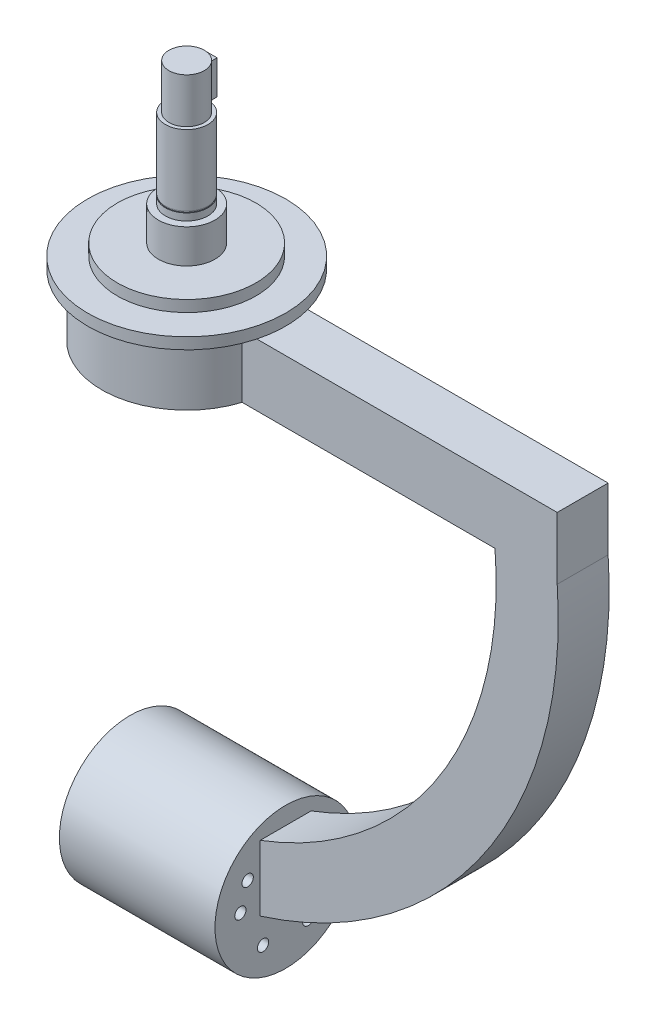
ISO-10303-21;
HEADER;
FILE_DESCRIPTION(('STEP AP214'),'2;1');
FILE_NAME('part.step','',(''),(''),'','','');
FILE_SCHEMA(('AUTOMOTIVE_DESIGN { 1 0 10303 214 1 1 1 1 }'));
ENDSEC;
DATA;
#1=APPLICATION_CONTEXT('core data for automotive mechanical design processes');
#2=APPLICATION_PROTOCOL_DEFINITION('international standard','automotive_design',2000,#1);
#3=PRODUCT_CONTEXT('',#1,'mechanical');
#4=PRODUCT('Part','Part','',(#3));
#5=PRODUCT_RELATED_PRODUCT_CATEGORY('part','',(#4));
#6=PRODUCT_DEFINITION_FORMATION('','',#4);
#7=PRODUCT_DEFINITION_CONTEXT('part definition',#1,'design');
#8=PRODUCT_DEFINITION('design','',#6,#7);
#9=PRODUCT_DEFINITION_SHAPE('','',#8);
#10=(LENGTH_UNIT() NAMED_UNIT(*) SI_UNIT(.MILLI.,.METRE.));
#11=(NAMED_UNIT(*) PLANE_ANGLE_UNIT() SI_UNIT($,.RADIAN.));
#12=(NAMED_UNIT(*) SI_UNIT($,.STERADIAN.) SOLID_ANGLE_UNIT());
#13=UNCERTAINTY_MEASURE_WITH_UNIT(LENGTH_MEASURE(1.E-05),#10,'distance_accuracy_value','');
#14=(GEOMETRIC_REPRESENTATION_CONTEXT(3) GLOBAL_UNCERTAINTY_ASSIGNED_CONTEXT((#13)) GLOBAL_UNIT_ASSIGNED_CONTEXT((#10,
#11,#12)) REPRESENTATION_CONTEXT('',''));
#15=CARTESIAN_POINT('',(0.,0.,0.));
#16=DIRECTION('',(0.,0.,1.));
#17=DIRECTION('',(1.,0.,0.));
#18=AXIS2_PLACEMENT_3D('',#15,#16,#17);
#19=CARTESIAN_POINT('',(0.,-160.641144237927,0.));
#20=DIRECTION('',(-1.,0.,0.));
#21=DIRECTION('',(0.,0.,-1.));
#22=AXIS2_PLACEMENT_3D('',#19,#20,#21);
#23=CYLINDRICAL_SURFACE('',#22,20.);
#24=CARTESIAN_POINT('',(-20.,-160.641144237927,0.));
#25=DIRECTION('',(1.,0.,0.));
#26=DIRECTION('',(0.,0.,-1.));
#27=AXIS2_PLACEMENT_3D('',#24,#25,#26);
#28=CIRCLE('',#27,20.);
#29=CARTESIAN_POINT('',(-20.,-160.641144237927,20.));
#30=VERTEX_POINT('',#29);
#31=EDGE_CURVE('E407',#30,#30,#28,.T.);
#32=ORIENTED_EDGE('',*,*,#31,.F.);
#33=DIRECTION('',(1.,0.,0.));
#34=VECTOR('',#33,1.);
#35=CARTESIAN_POINT('',(0.,-160.641144237927,20.));
#36=LINE('',#35,#34);
#37=CARTESIAN_POINT('',(30.,-160.641144237927,20.));
#38=VERTEX_POINT('',#37);
#39=EDGE_CURVE('E11',#30,#38,#36,.T.);
#40=ORIENTED_EDGE('',*,*,#39,.T.);
#41=CARTESIAN_POINT('',(30.,-160.641144237927,0.));
#42=DIRECTION('',(-1.,0.,0.));
#43=DIRECTION('',(0.,0.,-1.));
#44=AXIS2_PLACEMENT_3D('',#41,#42,#43);
#45=CIRCLE('',#44,20.);
#46=EDGE_CURVE('E343',#38,#38,#45,.T.);
#47=ORIENTED_EDGE('',*,*,#46,.F.);
#48=ORIENTED_EDGE('',*,*,#39,.F.);
#49=EDGE_LOOP('',(#32,#40,#47,#48));
#50=FACE_BOUND('',#49,.T.);
#51=ADVANCED_FACE('F17',(#50),#23,.F.);
#52=CARTESIAN_POINT('',(0.,-160.641144237927,0.));
#53=DIRECTION('',(-1.,0.,0.));
#54=DIRECTION('',(0.,0.,1.));
#55=AXIS2_PLACEMENT_3D('',#52,#53,#54);
#56=CYLINDRICAL_SURFACE('',#55,25.);
#57=CARTESIAN_POINT('',(-20.,-160.641144237927,0.));
#58=DIRECTION('',(-1.,0.,0.));
#59=DIRECTION('',(0.,0.,1.));
#60=AXIS2_PLACEMENT_3D('',#57,#58,#59);
#61=CIRCLE('',#60,25.);
#62=CARTESIAN_POINT('',(-20.,-160.641144237927,-25.));
#63=VERTEX_POINT('',#62);
#64=EDGE_CURVE('E405',#63,#63,#61,.T.);
#65=ORIENTED_EDGE('',*,*,#64,.F.);
#66=DIRECTION('',(1.,0.,0.));
#67=VECTOR('',#66,1.);
#68=CARTESIAN_POINT('',(0.,-160.641144237927,-25.));
#69=LINE('',#68,#67);
#70=CARTESIAN_POINT('',(35.,-160.641144237927,-25.));
#71=VERTEX_POINT('',#70);
#72=EDGE_CURVE('E27',#63,#71,#69,.T.);
#73=ORIENTED_EDGE('',*,*,#72,.T.);
#74=CARTESIAN_POINT('',(35.,-160.641144237927,0.));
#75=DIRECTION('',(1.,0.,0.));
#76=DIRECTION('',(0.,0.,-1.));
#77=AXIS2_PLACEMENT_3D('',#74,#75,#76);
#78=CIRCLE('',#77,25.);
#79=EDGE_CURVE('E304',#71,#71,#78,.T.);
#80=ORIENTED_EDGE('',*,*,#79,.F.);
#81=ORIENTED_EDGE('',*,*,#72,.F.);
#82=EDGE_LOOP('',(#65,#73,#80,#81));
#83=FACE_BOUND('',#82,.T.);
#84=ADVANCED_FACE('F531',(#83),#56,.T.);
#85=CARTESIAN_POINT('',(-20.,-160.641144237927,0.));
#86=DIRECTION('',(-1.,0.,0.));
#87=DIRECTION('',(0.,0.,1.));
#88=AXIS2_PLACEMENT_3D('',#85,#86,#87);
#89=PLANE('',#88);
#90=ORIENTED_EDGE('',*,*,#31,.T.);
#91=EDGE_LOOP('',(#90));
#92=FACE_BOUND('',#91,.T.);
#93=ORIENTED_EDGE('',*,*,#64,.T.);
#94=EDGE_LOOP('',(#93));
#95=FACE_BOUND('',#94,.T.);
#96=ADVANCED_FACE('F561',(#92,#95),#89,.T.);
#97=CARTESIAN_POINT('',(0.,0.,0.));
#98=DIRECTION('',(0.,1.,0.));
#99=DIRECTION('',(-1.,0.,0.));
#100=AXIS2_PLACEMENT_3D('',#97,#98,#99);
#101=CYLINDRICAL_SURFACE('',#100,30.);
#102=DIRECTION('',(0.,1.,0.));
#103=VECTOR('',#102,1.);
#104=CARTESIAN_POINT('',(28.6181760425084,11.,-9.));
#105=LINE('',#104,#103);
#106=CARTESIAN_POINT('',(28.6181760425084,-11.,-9.));
#107=VERTEX_POINT('',#106);
#108=CARTESIAN_POINT('',(28.6181760425084,11.,-9.));
#109=VERTEX_POINT('',#108);
#110=EDGE_CURVE('E221',#107,#109,#105,.T.);
#111=ORIENTED_EDGE('',*,*,#110,.F.);
#112=CARTESIAN_POINT('',(0.,-11.,0.));
#113=DIRECTION('',(0.,-1.,0.));
#114=DIRECTION('',(1.,0.,0.));
#115=AXIS2_PLACEMENT_3D('',#112,#113,#114);
#116=CIRCLE('',#115,30.);
#117=CARTESIAN_POINT('',(28.6181760425084,-11.,9.));
#118=VERTEX_POINT('',#117);
#119=EDGE_CURVE('E213',#118,#107,#116,.T.);
#120=ORIENTED_EDGE('',*,*,#119,.F.);
#121=DIRECTION('',(0.,1.,0.));
#122=VECTOR('',#121,1.);
#123=CARTESIAN_POINT('',(28.6181760425084,0.,9.));
#124=LINE('',#123,#122);
#125=CARTESIAN_POINT('',(28.6181760425084,11.,9.));
#126=VERTEX_POINT('',#125);
#127=EDGE_CURVE('E218',#118,#126,#124,.T.);
#128=ORIENTED_EDGE('',*,*,#127,.T.);
#129=CARTESIAN_POINT('',(0.,11.,0.));
#130=DIRECTION('',(0.,1.,0.));
#131=DIRECTION('',(-1.,0.,0.));
#132=AXIS2_PLACEMENT_3D('',#129,#130,#131);
#133=CIRCLE('',#132,30.);
#134=EDGE_CURVE('E21',#109,#126,#133,.T.);
#135=ORIENTED_EDGE('',*,*,#134,.F.);
#136=EDGE_LOOP('',(#111,#120,#128,#135));
#137=FACE_BOUND('',#136,.T.);
#138=ADVANCED_FACE('F215',(#137),#101,.T.);
#139=CARTESIAN_POINT('',(0.,15.,0.));
#140=DIRECTION('',(0.,1.,0.));
#141=DIRECTION('',(1.,0.,0.));
#142=AXIS2_PLACEMENT_3D('',#139,#140,#141);
#143=PLANE('',#142);
#144=CARTESIAN_POINT('',(0.,15.,0.));
#145=DIRECTION('',(0.,-1.,0.));
#146=DIRECTION('',(1.,0.,0.));
#147=AXIS2_PLACEMENT_3D('',#144,#145,#146);
#148=CIRCLE('',#147,24.5);
#149=CARTESIAN_POINT('',(-24.5,15.,0.));
#150=VERTEX_POINT('',#149);
#151=EDGE_CURVE('E305',#150,#150,#148,.T.);
#152=ORIENTED_EDGE('',*,*,#151,.T.);
#153=EDGE_LOOP('',(#152));
#154=FACE_BOUND('',#153,.T.);
#155=CARTESIAN_POINT('',(0.,15.,0.));
#156=DIRECTION('',(0.,1.,0.));
#157=DIRECTION('',(1.,0.,0.));
#158=AXIS2_PLACEMENT_3D('',#155,#156,#157);
#159=CIRCLE('',#158,35.);
#160=CARTESIAN_POINT('',(-35.,15.,0.));
#161=VERTEX_POINT('',#160);
#162=EDGE_CURVE('E406',#161,#161,#159,.T.);
#163=ORIENTED_EDGE('',*,*,#162,.T.);
#164=EDGE_LOOP('',(#163));
#165=FACE_BOUND('',#164,.T.);
#166=ADVANCED_FACE('F658',(#154,#165),#143,.T.);
#167=CARTESIAN_POINT('',(0.,11.,0.));
#168=DIRECTION('',(0.,1.,0.));
#169=DIRECTION('',(1.,0.,0.));
#170=AXIS2_PLACEMENT_3D('',#167,#168,#169);
#171=CYLINDRICAL_SURFACE('',#170,35.);
#172=ORIENTED_EDGE('',*,*,#162,.F.);
#173=DIRECTION('',(0.,-1.,0.));
#174=VECTOR('',#173,1.);
#175=CARTESIAN_POINT('',(-35.,11.,0.));
#176=LINE('',#175,#174);
#177=CARTESIAN_POINT('',(-35.,11.,0.));
#178=VERTEX_POINT('',#177);
#179=EDGE_CURVE('E401',#161,#178,#176,.T.);
#180=ORIENTED_EDGE('',*,*,#179,.T.);
#181=CARTESIAN_POINT('',(0.,11.,0.));
#182=DIRECTION('',(0.,1.,0.));
#183=DIRECTION('',(1.,0.,0.));
#184=AXIS2_PLACEMENT_3D('',#181,#182,#183);
#185=CIRCLE('',#184,35.);
#186=CARTESIAN_POINT('',(33.8230690505755,11.,9.));
#187=VERTEX_POINT('',#186);
#188=EDGE_CURVE('E397',#178,#187,#185,.T.);
#189=ORIENTED_EDGE('',*,*,#188,.T.);
#190=CARTESIAN_POINT('',(0.,11.,0.));
#191=DIRECTION('',(0.,1.,0.));
#192=DIRECTION('',(1.,0.,0.));
#193=AXIS2_PLACEMENT_3D('',#190,#191,#192);
#194=CIRCLE('',#193,35.);
#195=CARTESIAN_POINT('',(33.8230690505755,11.,-9.));
#196=VERTEX_POINT('',#195);
#197=EDGE_CURVE('E259',#187,#196,#194,.T.);
#198=ORIENTED_EDGE('',*,*,#197,.T.);
#199=CARTESIAN_POINT('',(0.,11.,0.));
#200=DIRECTION('',(0.,1.,0.));
#201=DIRECTION('',(1.,0.,0.));
#202=AXIS2_PLACEMENT_3D('',#199,#200,#201);
#203=CIRCLE('',#202,35.);
#204=EDGE_CURVE('E400',#196,#178,#203,.T.);
#205=ORIENTED_EDGE('',*,*,#204,.T.);
#206=ORIENTED_EDGE('',*,*,#179,.F.);
#207=EDGE_LOOP('',(#172,#180,#189,#198,#205,#206));
#208=FACE_BOUND('',#207,.T.);
#209=ADVANCED_FACE('F577',(#208),#171,.T.);
#210=CARTESIAN_POINT('',(0.,11.,0.));
#211=DIRECTION('',(0.,1.,0.));
#212=DIRECTION('',(1.,0.,0.));
#213=AXIS2_PLACEMENT_3D('',#210,#211,#212);
#214=PLANE('',#213);
#215=DIRECTION('',(-1.,0.,0.));
#216=VECTOR('',#215,1.);
#217=CARTESIAN_POINT('',(0.,11.,-9.));
#218=LINE('',#217,#216);
#219=EDGE_CURVE('E422',#196,#109,#218,.T.);
#220=ORIENTED_EDGE('',*,*,#219,.T.);
#221=ORIENTED_EDGE('',*,*,#134,.T.);
#222=DIRECTION('',(1.,0.,0.));
#223=VECTOR('',#222,1.);
#224=CARTESIAN_POINT('',(0.,11.,9.));
#225=LINE('',#224,#223);
#226=EDGE_CURVE('E241',#126,#187,#225,.T.);
#227=ORIENTED_EDGE('',*,*,#226,.T.);
#228=ORIENTED_EDGE('',*,*,#188,.F.);
#229=ORIENTED_EDGE('',*,*,#204,.F.);
#230=EDGE_LOOP('',(#220,#221,#227,#228,#229));
#231=FACE_BOUND('',#230,.T.);
#232=ADVANCED_FACE('F568',(#231),#214,.F.);
#233=CARTESIAN_POINT('',(140.,0.,0.));
#234=DIRECTION('',(1.,0.,0.));
#235=DIRECTION('',(0.,1.,0.));
#236=AXIS2_PLACEMENT_3D('',#233,#234,#235);
#237=PLANE('',#236);
#238=DIRECTION('',(0.,0.,-1.));
#239=VECTOR('',#238,1.);
#240=CARTESIAN_POINT('',(140.,-11.,9.));
#241=LINE('',#240,#239);
#242=CARTESIAN_POINT('',(140.,-11.,9.));
#243=VERTEX_POINT('',#242);
#244=CARTESIAN_POINT('',(140.,-11.,-9.));
#245=VERTEX_POINT('',#244);
#246=EDGE_CURVE('E235',#243,#245,#241,.T.);
#247=ORIENTED_EDGE('',*,*,#246,.T.);
#248=DIRECTION('',(0.,1.,0.));
#249=VECTOR('',#248,1.);
#250=CARTESIAN_POINT('',(140.,-11.,-9.));
#251=LINE('',#250,#249);
#252=CARTESIAN_POINT('',(140.,11.,-9.));
#253=VERTEX_POINT('',#252);
#254=EDGE_CURVE('E382',#245,#253,#251,.T.);
#255=ORIENTED_EDGE('',*,*,#254,.T.);
#256=DIRECTION('',(0.,0.,1.));
#257=VECTOR('',#256,1.);
#258=CARTESIAN_POINT('',(140.,11.,-35.));
#259=LINE('',#258,#257);
#260=CARTESIAN_POINT('',(140.,11.,9.));
#261=VERTEX_POINT('',#260);
#262=EDGE_CURVE('E226',#253,#261,#259,.T.);
#263=ORIENTED_EDGE('',*,*,#262,.T.);
#264=DIRECTION('',(0.,-1.,0.));
#265=VECTOR('',#264,1.);
#266=CARTESIAN_POINT('',(140.,11.,9.));
#267=LINE('',#266,#265);
#268=EDGE_CURVE('E272',#261,#243,#267,.T.);
#269=ORIENTED_EDGE('',*,*,#268,.T.);
#270=EDGE_LOOP('',(#247,#255,#263,#269));
#271=FACE_BOUND('',#270,.T.);
#272=ADVANCED_FACE('F566',(#271),#237,.T.);
#273=CARTESIAN_POINT('',(0.,-11.,9.));
#274=DIRECTION('',(0.,-1.,0.));
#275=DIRECTION('',(0.,0.,-1.));
#276=AXIS2_PLACEMENT_3D('',#273,#274,#275);
#277=PLANE('',#276);
#278=DIRECTION('',(1.,0.,0.));
#279=VECTOR('',#278,1.);
#280=CARTESIAN_POINT('',(0.,-11.,-9.));
#281=LINE('',#280,#279);
#282=CARTESIAN_POINT('',(118.,-11.,-9.));
#283=VERTEX_POINT('',#282);
#284=EDGE_CURVE('E340',#107,#283,#281,.T.);
#285=ORIENTED_EDGE('',*,*,#284,.T.);
#286=DIRECTION('',(0.,0.,1.));
#287=VECTOR('',#286,1.);
#288=CARTESIAN_POINT('',(118.,-11.,0.));
#289=LINE('',#288,#287);
#290=CARTESIAN_POINT('',(118.,-11.,9.));
#291=VERTEX_POINT('',#290);
#292=EDGE_CURVE('E231',#283,#291,#289,.T.);
#293=ORIENTED_EDGE('',*,*,#292,.T.);
#294=DIRECTION('',(1.,0.,0.));
#295=VECTOR('',#294,1.);
#296=CARTESIAN_POINT('',(0.,-11.,9.));
#297=LINE('',#296,#295);
#298=EDGE_CURVE('E229',#118,#291,#297,.T.);
#299=ORIENTED_EDGE('',*,*,#298,.F.);
#300=ORIENTED_EDGE('',*,*,#119,.T.);
#301=EDGE_LOOP('',(#285,#293,#299,#300));
#302=FACE_BOUND('',#301,.T.);
#303=ADVANCED_FACE('F230',(#302),#277,.T.);
#304=CARTESIAN_POINT('',(0.,11.,-9.));
#305=DIRECTION('',(0.,1.,0.));
#306=DIRECTION('',(1.,0.,0.));
#307=AXIS2_PLACEMENT_3D('',#304,#305,#306);
#308=PLANE('',#307);
#309=ORIENTED_EDGE('',*,*,#197,.F.);
#310=DIRECTION('',(1.,0.,0.));
#311=VECTOR('',#310,1.);
#312=CARTESIAN_POINT('',(0.,11.,9.));
#313=LINE('',#312,#311);
#314=EDGE_CURVE('E248',#187,#261,#313,.T.);
#315=ORIENTED_EDGE('',*,*,#314,.T.);
#316=ORIENTED_EDGE('',*,*,#262,.F.);
#317=DIRECTION('',(1.,0.,0.));
#318=VECTOR('',#317,1.);
#319=CARTESIAN_POINT('',(0.,11.,-9.));
#320=LINE('',#319,#318);
#321=EDGE_CURVE('E418',#196,#253,#320,.T.);
#322=ORIENTED_EDGE('',*,*,#321,.F.);
#323=EDGE_LOOP('',(#309,#315,#316,#322));
#324=FACE_BOUND('',#323,.T.);
#325=ADVANCED_FACE('F575',(#324),#308,.T.);
#326=CARTESIAN_POINT('',(0.,19.,0.));
#327=DIRECTION('',(0.,1.,0.));
#328=DIRECTION('',(1.,0.,0.));
#329=AXIS2_PLACEMENT_3D('',#326,#327,#328);
#330=PLANE('',#329);
#331=CARTESIAN_POINT('',(0.,19.,0.));
#332=DIRECTION('',(0.,-1.,0.));
#333=DIRECTION('',(1.,0.,0.));
#334=AXIS2_PLACEMENT_3D('',#331,#332,#333);
#335=CIRCLE('',#334,10.);
#336=CARTESIAN_POINT('',(-10.,19.,0.));
#337=VERTEX_POINT('',#336);
#338=EDGE_CURVE('E294',#337,#337,#335,.T.);
#339=ORIENTED_EDGE('',*,*,#338,.T.);
#340=EDGE_LOOP('',(#339));
#341=FACE_BOUND('',#340,.T.);
#342=CARTESIAN_POINT('',(0.,19.,0.));
#343=DIRECTION('',(0.,1.,0.));
#344=DIRECTION('',(1.,0.,0.));
#345=AXIS2_PLACEMENT_3D('',#342,#343,#344);
#346=CIRCLE('',#345,24.5);
#347=CARTESIAN_POINT('',(-24.5,19.,0.));
#348=VERTEX_POINT('',#347);
#349=EDGE_CURVE('E298',#348,#348,#346,.T.);
#350=ORIENTED_EDGE('',*,*,#349,.T.);
#351=EDGE_LOOP('',(#350));
#352=FACE_BOUND('',#351,.T.);
#353=ADVANCED_FACE('F633',(#341,#352),#330,.T.);
#354=CARTESIAN_POINT('',(0.,15.,0.));
#355=DIRECTION('',(0.,1.,0.));
#356=DIRECTION('',(1.,0.,0.));
#357=AXIS2_PLACEMENT_3D('',#354,#355,#356);
#358=CYLINDRICAL_SURFACE('',#357,24.5);
#359=ORIENTED_EDGE('',*,*,#349,.F.);
#360=DIRECTION('',(0.,-1.,0.));
#361=VECTOR('',#360,1.);
#362=CARTESIAN_POINT('',(-24.5,15.,0.));
#363=LINE('',#362,#361);
#364=EDGE_CURVE('E308',#348,#150,#363,.T.);
#365=ORIENTED_EDGE('',*,*,#364,.T.);
#366=ORIENTED_EDGE('',*,*,#151,.F.);
#367=ORIENTED_EDGE('',*,*,#364,.F.);
#368=EDGE_LOOP('',(#359,#365,#366,#367));
#369=FACE_BOUND('',#368,.T.);
#370=ADVANCED_FACE('F672',(#369),#358,.T.);
#371=CARTESIAN_POINT('',(0.,31.,0.));
#372=DIRECTION('',(0.,1.,0.));
#373=DIRECTION('',(1.,0.,0.));
#374=AXIS2_PLACEMENT_3D('',#371,#372,#373);
#375=PLANE('',#374);
#376=CARTESIAN_POINT('',(0.,31.,0.));
#377=DIRECTION('',(0.,1.,0.));
#378=DIRECTION('',(-1.,0.,0.));
#379=AXIS2_PLACEMENT_3D('',#376,#377,#378);
#380=CIRCLE('',#379,7.5);
#381=CARTESIAN_POINT('',(-7.5,31.,0.));
#382=VERTEX_POINT('',#381);
#383=EDGE_CURVE('E292',#382,#382,#380,.T.);
#384=ORIENTED_EDGE('',*,*,#383,.F.);
#385=EDGE_LOOP('',(#384));
#386=FACE_BOUND('',#385,.T.);
#387=CARTESIAN_POINT('',(0.,31.,0.));
#388=DIRECTION('',(0.,1.,0.));
#389=DIRECTION('',(1.,0.,0.));
#390=AXIS2_PLACEMENT_3D('',#387,#388,#389);
#391=CIRCLE('',#390,10.);
#392=CARTESIAN_POINT('',(-10.,31.,0.));
#393=VERTEX_POINT('',#392);
#394=EDGE_CURVE('E364',#393,#393,#391,.T.);
#395=ORIENTED_EDGE('',*,*,#394,.T.);
#396=EDGE_LOOP('',(#395));
#397=FACE_BOUND('',#396,.T.);
#398=ADVANCED_FACE('F661',(#386,#397),#375,.T.);
#399=CARTESIAN_POINT('',(0.,19.,0.));
#400=DIRECTION('',(0.,1.,0.));
#401=DIRECTION('',(1.,0.,0.));
#402=AXIS2_PLACEMENT_3D('',#399,#400,#401);
#403=CYLINDRICAL_SURFACE('',#402,10.);
#404=ORIENTED_EDGE('',*,*,#394,.F.);
#405=DIRECTION('',(0.,-1.,0.));
#406=VECTOR('',#405,1.);
#407=CARTESIAN_POINT('',(-10.,19.,0.));
#408=LINE('',#407,#406);
#409=EDGE_CURVE('E299',#393,#337,#408,.T.);
#410=ORIENTED_EDGE('',*,*,#409,.T.);
#411=ORIENTED_EDGE('',*,*,#338,.F.);
#412=ORIENTED_EDGE('',*,*,#409,.F.);
#413=EDGE_LOOP('',(#404,#410,#411,#412));
#414=FACE_BOUND('',#413,.T.);
#415=ADVANCED_FACE('F644',(#414),#403,.T.);
#416=CARTESIAN_POINT('',(0.,59.,0.));
#417=DIRECTION('',(0.,1.,0.));
#418=DIRECTION('',(1.,0.,0.));
#419=AXIS2_PLACEMENT_3D('',#416,#417,#418);
#420=PLANE('',#419);
#421=CARTESIAN_POINT('',(0.,59.,0.));
#422=DIRECTION('',(0.,-1.,0.));
#423=DIRECTION('',(1.,0.,0.));
#424=AXIS2_PLACEMENT_3D('',#421,#422,#423);
#425=CIRCLE('',#424,6.25);
#426=CARTESIAN_POINT('',(-6.25,59.,0.));
#427=VERTEX_POINT('',#426);
#428=EDGE_CURVE('E352',#427,#427,#425,.T.);
#429=ORIENTED_EDGE('',*,*,#428,.T.);
#430=EDGE_LOOP('',(#429));
#431=FACE_BOUND('',#430,.T.);
#432=CARTESIAN_POINT('',(0.,59.,0.));
#433=DIRECTION('',(0.,1.,0.));
#434=DIRECTION('',(1.,0.,0.));
#435=AXIS2_PLACEMENT_3D('',#432,#433,#434);
#436=CIRCLE('',#435,7.5);
#437=CARTESIAN_POINT('',(-7.5,59.,0.));
#438=VERTEX_POINT('',#437);
#439=EDGE_CURVE('E354',#438,#438,#436,.T.);
#440=ORIENTED_EDGE('',*,*,#439,.T.);
#441=EDGE_LOOP('',(#440));
#442=FACE_BOUND('',#441,.T.);
#443=ADVANCED_FACE('F640',(#431,#442),#420,.T.);
#444=CARTESIAN_POINT('',(0.,31.,0.));
#445=DIRECTION('',(0.,1.,0.));
#446=DIRECTION('',(1.,0.,0.));
#447=AXIS2_PLACEMENT_3D('',#444,#445,#446);
#448=CYLINDRICAL_SURFACE('',#447,7.5);
#449=ORIENTED_EDGE('',*,*,#439,.F.);
#450=DIRECTION('',(0.,-1.,0.));
#451=VECTOR('',#450,1.);
#452=CARTESIAN_POINT('',(-7.5,31.,0.));
#453=LINE('',#452,#451);
#454=CARTESIAN_POINT('',(-7.5,34.05,0.));
#455=VERTEX_POINT('',#454);
#456=EDGE_CURVE('E367',#438,#455,#453,.T.);
#457=ORIENTED_EDGE('',*,*,#456,.T.);
#458=CARTESIAN_POINT('',(0.,34.05,0.));
#459=DIRECTION('',(0.,1.,0.));
#460=DIRECTION('',(1.,0.,0.));
#461=AXIS2_PLACEMENT_3D('',#458,#459,#460);
#462=CIRCLE('',#461,7.5);
#463=EDGE_CURVE('E410',#455,#455,#462,.T.);
#464=ORIENTED_EDGE('',*,*,#463,.T.);
#465=ORIENTED_EDGE('',*,*,#456,.F.);
#466=EDGE_LOOP('',(#449,#457,#464,#465));
#467=FACE_BOUND('',#466,.T.);
#468=ADVANCED_FACE('F643',(#467),#448,.T.);
#469=CARTESIAN_POINT('',(0.,59.,0.));
#470=DIRECTION('',(0.,1.,0.));
#471=DIRECTION('',(1.,0.,0.));
#472=AXIS2_PLACEMENT_3D('',#469,#470,#471);
#473=CYLINDRICAL_SURFACE('',#472,6.25);
#474=CARTESIAN_POINT('',(0.,60.81,0.));
#475=DIRECTION('',(0.,1.,0.));
#476=DIRECTION('',(1.,0.,0.));
#477=AXIS2_PLACEMENT_3D('',#474,#475,#476);
#478=CIRCLE('',#477,6.25);
#479=CARTESIAN_POINT('',(2.5,60.81,-5.7282196186948));
#480=VERTEX_POINT('',#479);
#481=CARTESIAN_POINT('',(-2.5,60.81,-5.7282196186948));
#482=VERTEX_POINT('',#481);
#483=EDGE_CURVE('E319',#480,#482,#478,.T.);
#484=ORIENTED_EDGE('',*,*,#483,.F.);
#485=DIRECTION('',(0.,1.,0.));
#486=VECTOR('',#485,1.);
#487=CARTESIAN_POINT('',(2.5,60.81,-5.7282196186948));
#488=LINE('',#487,#486);
#489=CARTESIAN_POINT('',(2.5,72.81,-5.7282196186948));
#490=VERTEX_POINT('',#489);
#491=EDGE_CURVE('E320',#480,#490,#488,.T.);
#492=ORIENTED_EDGE('',*,*,#491,.T.);
#493=CARTESIAN_POINT('',(0.,72.81,0.));
#494=DIRECTION('',(0.,-1.,0.));
#495=DIRECTION('',(1.,0.,0.));
#496=AXIS2_PLACEMENT_3D('',#493,#494,#495);
#497=CIRCLE('',#496,6.25);
#498=CARTESIAN_POINT('',(-2.5,72.81,-5.7282196186948));
#499=VERTEX_POINT('',#498);
#500=EDGE_CURVE('E315',#499,#490,#497,.T.);
#501=ORIENTED_EDGE('',*,*,#500,.F.);
#502=DIRECTION('',(0.,1.,0.));
#503=VECTOR('',#502,1.);
#504=CARTESIAN_POINT('',(-2.5,60.81,-5.7282196186948));
#505=LINE('',#504,#503);
#506=EDGE_CURVE('E346',#482,#499,#505,.T.);
#507=ORIENTED_EDGE('',*,*,#506,.F.);
#508=EDGE_LOOP('',(#484,#492,#501,#507));
#509=FACE_BOUND('',#508,.T.);
#510=CARTESIAN_POINT('',(0.,74.88,0.));
#511=DIRECTION('',(0.,1.,0.));
#512=DIRECTION('',(1.,0.,0.));
#513=AXIS2_PLACEMENT_3D('',#510,#511,#512);
#514=CIRCLE('',#513,6.25);
#515=CARTESIAN_POINT('',(-6.25,74.88,0.));
#516=VERTEX_POINT('',#515);
#517=EDGE_CURVE('E456',#516,#516,#514,.T.);
#518=ORIENTED_EDGE('',*,*,#517,.F.);
#519=DIRECTION('',(0.,-1.,0.));
#520=VECTOR('',#519,1.);
#521=CARTESIAN_POINT('',(-6.25,59.,0.));
#522=LINE('',#521,#520);
#523=EDGE_CURVE('E328',#516,#427,#522,.T.);
#524=ORIENTED_EDGE('',*,*,#523,.T.);
#525=ORIENTED_EDGE('',*,*,#428,.F.);
#526=ORIENTED_EDGE('',*,*,#523,.F.);
#527=EDGE_LOOP('',(#518,#524,#525,#526));
#528=FACE_BOUND('',#527,.T.);
#529=ADVANCED_FACE('F668',(#509,#528),#473,.T.);
#530=CARTESIAN_POINT('',(0.,60.81,-1.));
#531=DIRECTION('',(0.,1.,0.));
#532=DIRECTION('',(1.,0.,0.));
#533=AXIS2_PLACEMENT_3D('',#530,#531,#532);
#534=PLANE('',#533);
#535=ORIENTED_EDGE('',*,*,#483,.T.);
#536=DIRECTION('',(0.,0.,1.));
#537=VECTOR('',#536,1.);
#538=CARTESIAN_POINT('',(-2.5,60.81,-8.25));
#539=LINE('',#538,#537);
#540=CARTESIAN_POINT('',(-2.5,60.81,-8.25));
#541=VERTEX_POINT('',#540);
#542=EDGE_CURVE('E351',#541,#482,#539,.T.);
#543=ORIENTED_EDGE('',*,*,#542,.F.);
#544=DIRECTION('',(-1.,0.,0.));
#545=VECTOR('',#544,1.);
#546=CARTESIAN_POINT('',(2.5,60.81,-8.25));
#547=LINE('',#546,#545);
#548=CARTESIAN_POINT('',(2.5,60.81,-8.25));
#549=VERTEX_POINT('',#548);
#550=EDGE_CURVE('E287',#549,#541,#547,.T.);
#551=ORIENTED_EDGE('',*,*,#550,.F.);
#552=DIRECTION('',(0.,0.,-1.));
#553=VECTOR('',#552,1.);
#554=CARTESIAN_POINT('',(2.5,60.81,-5.7282196186948));
#555=LINE('',#554,#553);
#556=EDGE_CURVE('E324',#480,#549,#555,.T.);
#557=ORIENTED_EDGE('',*,*,#556,.F.);
#558=EDGE_LOOP('',(#535,#543,#551,#557));
#559=FACE_BOUND('',#558,.T.);
#560=ADVANCED_FACE('F19',(#559),#534,.F.);
#561=CARTESIAN_POINT('',(0.,72.81,-1.));
#562=DIRECTION('',(0.,1.,0.));
#563=DIRECTION('',(1.,0.,0.));
#564=AXIS2_PLACEMENT_3D('',#561,#562,#563);
#565=PLANE('',#564);
#566=ORIENTED_EDGE('',*,*,#500,.T.);
#567=DIRECTION('',(0.,0.,-1.));
#568=VECTOR('',#567,1.);
#569=CARTESIAN_POINT('',(2.5,72.81,-5.7282196186948));
#570=LINE('',#569,#568);
#571=CARTESIAN_POINT('',(2.5,72.81,-8.25));
#572=VERTEX_POINT('',#571);
#573=EDGE_CURVE('E321',#490,#572,#570,.T.);
#574=ORIENTED_EDGE('',*,*,#573,.T.);
#575=DIRECTION('',(-1.,0.,0.));
#576=VECTOR('',#575,1.);
#577=CARTESIAN_POINT('',(2.5,72.81,-8.25));
#578=LINE('',#577,#576);
#579=CARTESIAN_POINT('',(-2.5,72.81,-8.25));
#580=VERTEX_POINT('',#579);
#581=EDGE_CURVE('E283',#572,#580,#578,.T.);
#582=ORIENTED_EDGE('',*,*,#581,.T.);
#583=DIRECTION('',(0.,0.,1.));
#584=VECTOR('',#583,1.);
#585=CARTESIAN_POINT('',(-2.5,72.81,-8.25));
#586=LINE('',#585,#584);
#587=EDGE_CURVE('E350',#580,#499,#586,.T.);
#588=ORIENTED_EDGE('',*,*,#587,.T.);
#589=EDGE_LOOP('',(#566,#574,#582,#588));
#590=FACE_BOUND('',#589,.T.);
#591=ADVANCED_FACE('F664',(#590),#565,.T.);
#592=CARTESIAN_POINT('',(2.5,60.81,-5.7282196186948));
#593=DIRECTION('',(1.,0.,0.));
#594=DIRECTION('',(0.,1.,0.));
#595=AXIS2_PLACEMENT_3D('',#592,#593,#594);
#596=PLANE('',#595);
#597=ORIENTED_EDGE('',*,*,#556,.T.);
#598=DIRECTION('',(0.,1.,0.));
#599=VECTOR('',#598,1.);
#600=CARTESIAN_POINT('',(2.5,60.81,-8.25));
#601=LINE('',#600,#599);
#602=EDGE_CURVE('E286',#549,#572,#601,.T.);
#603=ORIENTED_EDGE('',*,*,#602,.T.);
#604=ORIENTED_EDGE('',*,*,#573,.F.);
#605=ORIENTED_EDGE('',*,*,#491,.F.);
#606=EDGE_LOOP('',(#597,#603,#604,#605));
#607=FACE_BOUND('',#606,.T.);
#608=ADVANCED_FACE('F623',(#607),#596,.T.);
#609=CARTESIAN_POINT('',(2.5,60.81,-8.25));
#610=DIRECTION('',(0.,0.,-1.));
#611=DIRECTION('',(0.,-1.,0.));
#612=AXIS2_PLACEMENT_3D('',#609,#610,#611);
#613=PLANE('',#612);
#614=ORIENTED_EDGE('',*,*,#550,.T.);
#615=DIRECTION('',(0.,1.,0.));
#616=VECTOR('',#615,1.);
#617=CARTESIAN_POINT('',(-2.5,60.81,-8.25));
#618=LINE('',#617,#616);
#619=EDGE_CURVE('E425',#541,#580,#618,.T.);
#620=ORIENTED_EDGE('',*,*,#619,.T.);
#621=ORIENTED_EDGE('',*,*,#581,.F.);
#622=ORIENTED_EDGE('',*,*,#602,.F.);
#623=EDGE_LOOP('',(#614,#620,#621,#622));
#624=FACE_BOUND('',#623,.T.);
#625=ADVANCED_FACE('F564',(#624),#613,.T.);
#626=CARTESIAN_POINT('',(-2.5,60.81,-8.25));
#627=DIRECTION('',(-1.,0.,0.));
#628=DIRECTION('',(0.,0.,1.));
#629=AXIS2_PLACEMENT_3D('',#626,#627,#628);
#630=PLANE('',#629);
#631=ORIENTED_EDGE('',*,*,#542,.T.);
#632=ORIENTED_EDGE('',*,*,#506,.T.);
#633=ORIENTED_EDGE('',*,*,#587,.F.);
#634=ORIENTED_EDGE('',*,*,#619,.F.);
#635=EDGE_LOOP('',(#631,#632,#633,#634));
#636=FACE_BOUND('',#635,.T.);
#637=ADVANCED_FACE('F626',(#636),#630,.T.);
#638=CARTESIAN_POINT('',(0.,74.88,0.));
#639=DIRECTION('',(0.,1.,0.));
#640=DIRECTION('',(1.,0.,0.));
#641=AXIS2_PLACEMENT_3D('',#638,#639,#640);
#642=PLANE('',#641);
#643=ORIENTED_EDGE('',*,*,#517,.T.);
#644=EDGE_LOOP('',(#643));
#645=FACE_BOUND('',#644,.T.);
#646=ADVANCED_FACE('F629',(#645),#642,.T.);
#647=CARTESIAN_POINT('',(0.,31.,0.));
#648=DIRECTION('',(0.,1.,0.));
#649=DIRECTION('',(1.,0.,0.));
#650=AXIS2_PLACEMENT_3D('',#647,#648,#649);
#651=CYLINDRICAL_SURFACE('',#650,7.5);
#652=CARTESIAN_POINT('',(0.,33.5,0.));
#653=DIRECTION('',(0.,-1.,0.));
#654=DIRECTION('',(1.,0.,0.));
#655=AXIS2_PLACEMENT_3D('',#652,#653,#654);
#656=CIRCLE('',#655,7.5);
#657=CARTESIAN_POINT('',(-7.5,33.5,0.));
#658=VERTEX_POINT('',#657);
#659=EDGE_CURVE('E293',#658,#658,#656,.T.);
#660=ORIENTED_EDGE('',*,*,#659,.T.);
#661=DIRECTION('',(0.,-1.,0.));
#662=VECTOR('',#661,1.);
#663=CARTESIAN_POINT('',(-7.5,31.,0.));
#664=LINE('',#663,#662);
#665=EDGE_CURVE('E288',#658,#382,#664,.T.);
#666=ORIENTED_EDGE('',*,*,#665,.T.);
#667=ORIENTED_EDGE('',*,*,#383,.T.);
#668=ORIENTED_EDGE('',*,*,#665,.F.);
#669=EDGE_LOOP('',(#660,#666,#667,#668));
#670=FACE_BOUND('',#669,.T.);
#671=ADVANCED_FACE('F638',(#670),#651,.T.);
#672=CARTESIAN_POINT('',(0.,33.5,0.));
#673=DIRECTION('',(0.,1.,0.));
#674=DIRECTION('',(1.,0.,0.));
#675=AXIS2_PLACEMENT_3D('',#672,#673,#674);
#676=PLANE('',#675);
#677=CARTESIAN_POINT('',(0.,33.5,0.));
#678=DIRECTION('',(0.,-1.,0.));
#679=DIRECTION('',(-1.,0.,0.));
#680=AXIS2_PLACEMENT_3D('',#677,#678,#679);
#681=CIRCLE('',#680,7.25);
#682=CARTESIAN_POINT('',(7.25,33.5,0.));
#683=VERTEX_POINT('',#682);
#684=EDGE_CURVE('E254',#683,#683,#681,.T.);
#685=ORIENTED_EDGE('',*,*,#684,.T.);
#686=EDGE_LOOP('',(#685));
#687=FACE_BOUND('',#686,.T.);
#688=ORIENTED_EDGE('',*,*,#659,.F.);
#689=EDGE_LOOP('',(#688));
#690=FACE_BOUND('',#689,.T.);
#691=ADVANCED_FACE('F634',(#687,#690),#676,.T.);
#692=CARTESIAN_POINT('',(0.,34.05,0.));
#693=DIRECTION('',(0.,1.,0.));
#694=DIRECTION('',(1.,0.,0.));
#695=AXIS2_PLACEMENT_3D('',#692,#693,#694);
#696=PLANE('',#695);
#697=CARTESIAN_POINT('',(0.,34.05,0.));
#698=DIRECTION('',(0.,-1.,0.));
#699=DIRECTION('',(-1.,0.,0.));
#700=AXIS2_PLACEMENT_3D('',#697,#698,#699);
#701=CIRCLE('',#700,7.25);
#702=CARTESIAN_POINT('',(7.25,34.05,0.));
#703=VERTEX_POINT('',#702);
#704=EDGE_CURVE('E414',#703,#703,#701,.T.);
#705=ORIENTED_EDGE('',*,*,#704,.F.);
#706=EDGE_LOOP('',(#705));
#707=FACE_BOUND('',#706,.T.);
#708=ORIENTED_EDGE('',*,*,#463,.F.);
#709=EDGE_LOOP('',(#708));
#710=FACE_BOUND('',#709,.T.);
#711=ADVANCED_FACE('F637',(#707,#710),#696,.F.);
#712=CARTESIAN_POINT('',(0.,33.5,0.));
#713=DIRECTION('',(0.,1.,0.));
#714=DIRECTION('',(-1.,0.,0.));
#715=AXIS2_PLACEMENT_3D('',#712,#713,#714);
#716=CYLINDRICAL_SURFACE('',#715,7.25);
#717=ORIENTED_EDGE('',*,*,#684,.F.);
#718=DIRECTION('',(0.,1.,0.));
#719=VECTOR('',#718,1.);
#720=CARTESIAN_POINT('',(7.25,33.5,0.));
#721=LINE('',#720,#719);
#722=EDGE_CURVE('E205',#683,#703,#721,.T.);
#723=ORIENTED_EDGE('',*,*,#722,.T.);
#724=ORIENTED_EDGE('',*,*,#704,.T.);
#725=ORIENTED_EDGE('',*,*,#722,.F.);
#726=EDGE_LOOP('',(#717,#723,#724,#725));
#727=FACE_BOUND('',#726,.T.);
#728=ADVANCED_FACE('F651',(#727),#716,.T.);
#729=CARTESIAN_POINT('',(-10.,-21.5966666666667,0.));
#730=DIRECTION('',(0.,0.,-1.));
#731=DIRECTION('',(0.997106716721264,0.0760144425049617,0.));
#732=AXIS2_PLACEMENT_3D('',#729,#730,#731);
#733=CYLINDRICAL_SURFACE('',#732,150.373831980316);
#734=DIRECTION('',(0.,0.,-1.));
#735=VECTOR('',#734,1.);
#736=CARTESIAN_POINT('',(35.,-165.079381111454,0.));
#737=LINE('',#736,#735);
#738=CARTESIAN_POINT('',(35.,-165.079381111454,9.));
#739=VERTEX_POINT('',#738);
#740=CARTESIAN_POINT('',(35.,-165.079381111454,-9.));
#741=VERTEX_POINT('',#740);
#742=EDGE_CURVE('E341',#739,#741,#737,.T.);
#743=ORIENTED_EDGE('',*,*,#742,.T.);
#744=CARTESIAN_POINT('',(-10.,-21.5966666666666,-9.));
#745=DIRECTION('',(0.,0.,-1.));
#746=DIRECTION('',(0.997513982483565,0.0704688211181163,0.));
#747=AXIS2_PLACEMENT_3D('',#744,#745,#746);
#748=CIRCLE('',#747,150.373831980316);
#749=EDGE_CURVE('E379',#245,#741,#748,.T.);
#750=ORIENTED_EDGE('',*,*,#749,.F.);
#751=ORIENTED_EDGE('',*,*,#246,.F.);
#752=CARTESIAN_POINT('',(-10.,-21.5966666666666,9.));
#753=DIRECTION('',(0.,0.,-1.));
#754=DIRECTION('',(0.997513982483565,0.0704688211181163,0.));
#755=AXIS2_PLACEMENT_3D('',#752,#753,#754);
#756=CIRCLE('',#755,150.373831980316);
#757=EDGE_CURVE('E276',#243,#739,#756,.T.);
#758=ORIENTED_EDGE('',*,*,#757,.T.);
#759=EDGE_LOOP('',(#743,#750,#751,#758));
#760=FACE_BOUND('',#759,.T.);
#761=ADVANCED_FACE('F585',(#760),#733,.T.);
#762=CARTESIAN_POINT('',(0.,11.,9.));
#763=DIRECTION('',(0.,0.,1.));
#764=DIRECTION('',(1.,0.,0.));
#765=AXIS2_PLACEMENT_3D('',#762,#763,#764);
#766=PLANE('',#765);
#767=DIRECTION('',(0.,-1.,0.));
#768=VECTOR('',#767,1.);
#769=CARTESIAN_POINT('',(35.,-74.8205721189635,9.));
#770=LINE('',#769,#768);
#771=CARTESIAN_POINT('',(35.,-141.893338875188,9.));
#772=VERTEX_POINT('',#771);
#773=EDGE_CURVE('E300',#772,#739,#770,.T.);
#774=ORIENTED_EDGE('',*,*,#773,.T.);
#775=ORIENTED_EDGE('',*,*,#757,.F.);
#776=ORIENTED_EDGE('',*,*,#268,.F.);
#777=ORIENTED_EDGE('',*,*,#314,.F.);
#778=ORIENTED_EDGE('',*,*,#226,.F.);
#779=ORIENTED_EDGE('',*,*,#127,.F.);
#780=ORIENTED_EDGE('',*,*,#298,.T.);
#781=CARTESIAN_POINT('',(-10.,-21.5966666666666,9.));
#782=DIRECTION('',(0.,0.,-1.));
#783=DIRECTION('',(0.996590715581543,0.0825042157508777,0.));
#784=AXIS2_PLACEMENT_3D('',#781,#782,#783);
#785=CIRCLE('',#784,128.437881267344);
#786=EDGE_CURVE('E344',#291,#772,#785,.T.);
#787=ORIENTED_EDGE('',*,*,#786,.T.);
#788=EDGE_LOOP('',(#774,#775,#776,#777,#778,#779,#780,#787));
#789=FACE_BOUND('',#788,.T.);
#790=ADVANCED_FACE('F238',(#789),#766,.T.);
#791=CARTESIAN_POINT('',(30.,-160.641144237927,0.));
#792=DIRECTION('',(-1.,0.,0.));
#793=DIRECTION('',(0.,0.,1.));
#794=AXIS2_PLACEMENT_3D('',#791,#792,#793);
#795=PLANE('',#794);
#796=CARTESIAN_POINT('',(30.,-151.940727157024,13.4276856761819));
#797=DIRECTION('',(1.,0.,0.));
#798=DIRECTION('',(0.,0.,-1.));
#799=AXIS2_PLACEMENT_3D('',#796,#797,#798);
#800=CIRCLE('',#799,2.);
#801=CARTESIAN_POINT('',(30.,-151.940727157024,15.4276856761819));
#802=VERTEX_POINT('',#801);
#803=EDGE_CURVE('E378',#802,#802,#800,.T.);
#804=ORIENTED_EDGE('',*,*,#803,.T.);
#805=EDGE_LOOP('',(#804));
#806=FACE_BOUND('',#805,.T.);
#807=CARTESIAN_POINT('',(30.,-174.497550698478,-8.));
#808=DIRECTION('',(1.,0.,0.));
#809=DIRECTION('',(0.,0.,-1.));
#810=AXIS2_PLACEMENT_3D('',#807,#808,#809);
#811=CIRCLE('',#810,2.);
#812=CARTESIAN_POINT('',(30.,-174.497550698478,-6.));
#813=VERTEX_POINT('',#812);
#814=EDGE_CURVE('E282',#813,#813,#811,.T.);
#815=ORIENTED_EDGE('',*,*,#814,.T.);
#816=EDGE_LOOP('',(#815));
#817=FACE_BOUND('',#816,.T.);
#818=CARTESIAN_POINT('',(30.,-174.497550698478,8.));
#819=DIRECTION('',(1.,0.,0.));
#820=DIRECTION('',(0.,0.,-1.));
#821=AXIS2_PLACEMENT_3D('',#818,#819,#820);
#822=CIRCLE('',#821,2.);
#823=CARTESIAN_POINT('',(30.,-174.497550698478,10.));
#824=VERTEX_POINT('',#823);
#825=EDGE_CURVE('E260',#824,#824,#822,.T.);
#826=ORIENTED_EDGE('',*,*,#825,.T.);
#827=EDGE_LOOP('',(#826));
#828=FACE_BOUND('',#827,.T.);
#829=CARTESIAN_POINT('',(30.,-151.926919677686,-13.4187290871269));
#830=DIRECTION('',(1.,0.,0.));
#831=DIRECTION('',(0.,0.,-1.));
#832=AXIS2_PLACEMENT_3D('',#829,#830,#831);
#833=CIRCLE('',#832,2.);
#834=CARTESIAN_POINT('',(30.,-151.926919677686,-11.4187290871269));
#835=VERTEX_POINT('',#834);
#836=EDGE_CURVE('E467',#835,#835,#833,.T.);
#837=ORIENTED_EDGE('',*,*,#836,.T.);
#838=EDGE_LOOP('',(#837));
#839=FACE_BOUND('',#838,.T.);
#840=CARTESIAN_POINT('',(30.,-160.641144237927,-16.));
#841=DIRECTION('',(1.,0.,0.));
#842=DIRECTION('',(0.,0.,-1.));
#843=AXIS2_PLACEMENT_3D('',#840,#841,#842);
#844=CIRCLE('',#843,2.);
#845=CARTESIAN_POINT('',(30.,-160.641144237927,-14.));
#846=VERTEX_POINT('',#845);
#847=EDGE_CURVE('E266',#846,#846,#844,.T.);
#848=ORIENTED_EDGE('',*,*,#847,.T.);
#849=EDGE_LOOP('',(#848));
#850=FACE_BOUND('',#849,.T.);
#851=CARTESIAN_POINT('',(30.,-160.641144237927,16.));
#852=DIRECTION('',(1.,0.,0.));
#853=DIRECTION('',(0.,0.,-1.));
#854=AXIS2_PLACEMENT_3D('',#851,#852,#853);
#855=CIRCLE('',#854,2.);
#856=CARTESIAN_POINT('',(30.,-160.641144237927,18.));
#857=VERTEX_POINT('',#856);
#858=EDGE_CURVE('E309',#857,#857,#855,.T.);
#859=ORIENTED_EDGE('',*,*,#858,.T.);
#860=EDGE_LOOP('',(#859));
#861=FACE_BOUND('',#860,.T.);
#862=ORIENTED_EDGE('',*,*,#46,.T.);
#863=EDGE_LOOP('',(#862));
#864=FACE_BOUND('',#863,.T.);
#865=ADVANCED_FACE('F606',(#806,#817,#828,#839,#850,#861,#864),#795,.T.);
#866=CARTESIAN_POINT('',(-10.,-21.5966666666667,0.));
#867=DIRECTION('',(0.,0.,-1.));
#868=DIRECTION('',(0.997106716721264,0.0760144425049617,0.));
#869=AXIS2_PLACEMENT_3D('',#866,#867,#868);
#870=CYLINDRICAL_SURFACE('',#869,128.437881267344);
#871=DIRECTION('',(0.,0.,1.));
#872=VECTOR('',#871,1.);
#873=CARTESIAN_POINT('',(35.,-141.893338875188,0.));
#874=LINE('',#873,#872);
#875=CARTESIAN_POINT('',(35.,-141.893338875188,-9.));
#876=VERTEX_POINT('',#875);
#877=EDGE_CURVE('E303',#876,#772,#874,.T.);
#878=ORIENTED_EDGE('',*,*,#877,.T.);
#879=ORIENTED_EDGE('',*,*,#786,.F.);
#880=ORIENTED_EDGE('',*,*,#292,.F.);
#881=CARTESIAN_POINT('',(-10.,-21.5966666666666,-9.));
#882=DIRECTION('',(0.,0.,-1.));
#883=DIRECTION('',(0.996590715581543,0.0825042157508777,0.));
#884=AXIS2_PLACEMENT_3D('',#881,#882,#883);
#885=CIRCLE('',#884,128.437881267344);
#886=EDGE_CURVE('E336',#283,#876,#885,.T.);
#887=ORIENTED_EDGE('',*,*,#886,.T.);
#888=EDGE_LOOP('',(#878,#879,#880,#887));
#889=FACE_BOUND('',#888,.T.);
#890=ADVANCED_FACE('F548',(#889),#870,.F.);
#891=CARTESIAN_POINT('',(0.,-11.,-9.));
#892=DIRECTION('',(0.,0.,-1.));
#893=DIRECTION('',(0.,-1.,0.));
#894=AXIS2_PLACEMENT_3D('',#891,#892,#893);
#895=PLANE('',#894);
#896=DIRECTION('',(0.,1.,0.));
#897=VECTOR('',#896,1.);
#898=CARTESIAN_POINT('',(35.,-85.8205721189635,-9.));
#899=LINE('',#898,#897);
#900=EDGE_CURVE('E396',#741,#876,#899,.T.);
#901=ORIENTED_EDGE('',*,*,#900,.T.);
#902=ORIENTED_EDGE('',*,*,#886,.F.);
#903=ORIENTED_EDGE('',*,*,#284,.F.);
#904=ORIENTED_EDGE('',*,*,#110,.T.);
#905=ORIENTED_EDGE('',*,*,#219,.F.);
#906=ORIENTED_EDGE('',*,*,#321,.T.);
#907=ORIENTED_EDGE('',*,*,#254,.F.);
#908=ORIENTED_EDGE('',*,*,#749,.T.);
#909=EDGE_LOOP('',(#901,#902,#903,#904,#905,#906,#907,#908));
#910=FACE_BOUND('',#909,.T.);
#911=ADVANCED_FACE('F536',(#910),#895,.T.);
#912=CARTESIAN_POINT('',(35.,-160.641144237927,0.));
#913=DIRECTION('',(1.,0.,0.));
#914=DIRECTION('',(0.,1.,0.));
#915=AXIS2_PLACEMENT_3D('',#912,#913,#914);
#916=PLANE('',#915);
#917=ORIENTED_EDGE('',*,*,#773,.F.);
#918=ORIENTED_EDGE('',*,*,#877,.F.);
#919=ORIENTED_EDGE('',*,*,#900,.F.);
#920=ORIENTED_EDGE('',*,*,#742,.F.);
#921=EDGE_LOOP('',(#917,#918,#919,#920));
#922=FACE_BOUND('',#921,.T.);
#923=CARTESIAN_POINT('',(35.,-151.940727157024,13.4276856761819));
#924=DIRECTION('',(-1.,0.,0.));
#925=DIRECTION('',(0.,0.,-1.));
#926=AXIS2_PLACEMENT_3D('',#923,#924,#925);
#927=CIRCLE('',#926,2.);
#928=CARTESIAN_POINT('',(35.,-151.940727157024,15.4276856761819));
#929=VERTEX_POINT('',#928);
#930=EDGE_CURVE('E277',#929,#929,#927,.T.);
#931=ORIENTED_EDGE('',*,*,#930,.T.);
#932=EDGE_LOOP('',(#931));
#933=FACE_BOUND('',#932,.T.);
#934=CARTESIAN_POINT('',(35.,-174.497550698478,-8.));
#935=DIRECTION('',(-1.,0.,0.));
#936=DIRECTION('',(0.,0.,-1.));
#937=AXIS2_PLACEMENT_3D('',#934,#935,#936);
#938=CIRCLE('',#937,2.);
#939=CARTESIAN_POINT('',(35.,-174.497550698478,-6.));
#940=VERTEX_POINT('',#939);
#941=EDGE_CURVE('E264',#940,#940,#938,.T.);
#942=ORIENTED_EDGE('',*,*,#941,.T.);
#943=EDGE_LOOP('',(#942));
#944=FACE_BOUND('',#943,.T.);
#945=CARTESIAN_POINT('',(35.,-174.497550698478,8.));
#946=DIRECTION('',(-1.,0.,0.));
#947=DIRECTION('',(0.,0.,-1.));
#948=AXIS2_PLACEMENT_3D('',#945,#946,#947);
#949=CIRCLE('',#948,2.);
#950=CARTESIAN_POINT('',(35.,-174.497550698478,10.));
#951=VERTEX_POINT('',#950);
#952=EDGE_CURVE('E510',#951,#951,#949,.T.);
#953=ORIENTED_EDGE('',*,*,#952,.T.);
#954=EDGE_LOOP('',(#953));
#955=FACE_BOUND('',#954,.T.);
#956=CARTESIAN_POINT('',(35.,-151.926919677686,-13.4187290871269));
#957=DIRECTION('',(-1.,0.,0.));
#958=DIRECTION('',(0.,0.,-1.));
#959=AXIS2_PLACEMENT_3D('',#956,#957,#958);
#960=CIRCLE('',#959,2.);
#961=CARTESIAN_POINT('',(35.,-151.926919677686,-11.4187290871269));
#962=VERTEX_POINT('',#961);
#963=EDGE_CURVE('E270',#962,#962,#960,.T.);
#964=ORIENTED_EDGE('',*,*,#963,.T.);
#965=EDGE_LOOP('',(#964));
#966=FACE_BOUND('',#965,.T.);
#967=CARTESIAN_POINT('',(35.,-160.641144237927,-16.));
#968=DIRECTION('',(-1.,0.,0.));
#969=DIRECTION('',(0.,0.,-1.));
#970=AXIS2_PLACEMENT_3D('',#967,#968,#969);
#971=CIRCLE('',#970,2.);
#972=CARTESIAN_POINT('',(35.,-160.641144237927,-14.));
#973=VERTEX_POINT('',#972);
#974=EDGE_CURVE('E313',#973,#973,#971,.T.);
#975=ORIENTED_EDGE('',*,*,#974,.T.);
#976=EDGE_LOOP('',(#975));
#977=FACE_BOUND('',#976,.T.);
#978=CARTESIAN_POINT('',(35.,-160.641144237927,16.));
#979=DIRECTION('',(-1.,0.,0.));
#980=DIRECTION('',(0.,0.,-1.));
#981=AXIS2_PLACEMENT_3D('',#978,#979,#980);
#982=CIRCLE('',#981,2.);
#983=CARTESIAN_POINT('',(35.,-160.641144237927,18.));
#984=VERTEX_POINT('',#983);
#985=EDGE_CURVE('E332',#984,#984,#982,.T.);
#986=ORIENTED_EDGE('',*,*,#985,.T.);
#987=EDGE_LOOP('',(#986));
#988=FACE_BOUND('',#987,.T.);
#989=ORIENTED_EDGE('',*,*,#79,.T.);
#990=EDGE_LOOP('',(#989));
#991=FACE_BOUND('',#990,.T.);
#992=ADVANCED_FACE('F533',(#922,#933,#944,#955,#966,#977,#988,#991),#916,.T.);
#993=CARTESIAN_POINT('',(35.,-151.940727157024,13.4276856761819));
#994=DIRECTION('',(-1.,0.,0.));
#995=DIRECTION('',(0.,0.,-1.));
#996=AXIS2_PLACEMENT_3D('',#993,#994,#995);
#997=CYLINDRICAL_SURFACE('',#996,2.);
#998=ORIENTED_EDGE('',*,*,#930,.F.);
#999=DIRECTION('',(-1.,0.,0.));
#1000=VECTOR('',#999,1.);
#1001=CARTESIAN_POINT('',(35.,-151.940727157024,15.4276856761819));
#1002=LINE('',#1001,#1000);
#1003=EDGE_CURVE('E281',#929,#802,#1002,.T.);
#1004=ORIENTED_EDGE('',*,*,#1003,.T.);
#1005=ORIENTED_EDGE('',*,*,#803,.F.);
#1006=ORIENTED_EDGE('',*,*,#1003,.F.);
#1007=EDGE_LOOP('',(#998,#1004,#1005,#1006));
#1008=FACE_BOUND('',#1007,.T.);
#1009=ADVANCED_FACE('F535',(#1008),#997,.F.);
#1010=CARTESIAN_POINT('',(35.,-174.497550698478,-8.));
#1011=DIRECTION('',(-1.,0.,0.));
#1012=DIRECTION('',(0.,0.,-1.));
#1013=AXIS2_PLACEMENT_3D('',#1010,#1011,#1012);
#1014=CYLINDRICAL_SURFACE('',#1013,2.);
#1015=ORIENTED_EDGE('',*,*,#941,.F.);
#1016=DIRECTION('',(-1.,0.,0.));
#1017=VECTOR('',#1016,1.);
#1018=CARTESIAN_POINT('',(35.,-174.497550698478,-6.));
#1019=LINE('',#1018,#1017);
#1020=EDGE_CURVE('E252',#940,#813,#1019,.T.);
#1021=ORIENTED_EDGE('',*,*,#1020,.T.);
#1022=ORIENTED_EDGE('',*,*,#814,.F.);
#1023=ORIENTED_EDGE('',*,*,#1020,.F.);
#1024=EDGE_LOOP('',(#1015,#1021,#1022,#1023));
#1025=FACE_BOUND('',#1024,.T.);
#1026=ADVANCED_FACE('F545',(#1025),#1014,.F.);
#1027=CARTESIAN_POINT('',(35.,-174.497550698478,8.));
#1028=DIRECTION('',(-1.,0.,0.));
#1029=DIRECTION('',(0.,0.,-1.));
#1030=AXIS2_PLACEMENT_3D('',#1027,#1028,#1029);
#1031=CYLINDRICAL_SURFACE('',#1030,2.);
#1032=ORIENTED_EDGE('',*,*,#952,.F.);
#1033=DIRECTION('',(-1.,0.,0.));
#1034=VECTOR('',#1033,1.);
#1035=CARTESIAN_POINT('',(35.,-174.497550698478,10.));
#1036=LINE('',#1035,#1034);
#1037=EDGE_CURVE('E265',#951,#824,#1036,.T.);
#1038=ORIENTED_EDGE('',*,*,#1037,.T.);
#1039=ORIENTED_EDGE('',*,*,#825,.F.);
#1040=ORIENTED_EDGE('',*,*,#1037,.F.);
#1041=EDGE_LOOP('',(#1032,#1038,#1039,#1040));
#1042=FACE_BOUND('',#1041,.T.);
#1043=ADVANCED_FACE('F608',(#1042),#1031,.F.);
#1044=CARTESIAN_POINT('',(35.,-151.926919677686,-13.4187290871269));
#1045=DIRECTION('',(-1.,0.,0.));
#1046=DIRECTION('',(0.,0.,-1.));
#1047=AXIS2_PLACEMENT_3D('',#1044,#1045,#1046);
#1048=CYLINDRICAL_SURFACE('',#1047,2.);
#1049=ORIENTED_EDGE('',*,*,#963,.F.);
#1050=DIRECTION('',(-1.,0.,0.));
#1051=VECTOR('',#1050,1.);
#1052=CARTESIAN_POINT('',(35.,-151.926919677686,-11.4187290871269));
#1053=LINE('',#1052,#1051);
#1054=EDGE_CURVE('E389',#962,#835,#1053,.T.);
#1055=ORIENTED_EDGE('',*,*,#1054,.T.);
#1056=ORIENTED_EDGE('',*,*,#836,.F.);
#1057=ORIENTED_EDGE('',*,*,#1054,.F.);
#1058=EDGE_LOOP('',(#1049,#1055,#1056,#1057));
#1059=FACE_BOUND('',#1058,.T.);
#1060=ADVANCED_FACE('F610',(#1059),#1048,.F.);
#1061=CARTESIAN_POINT('',(35.,-160.641144237927,-16.));
#1062=DIRECTION('',(-1.,0.,0.));
#1063=DIRECTION('',(0.,0.,-1.));
#1064=AXIS2_PLACEMENT_3D('',#1061,#1062,#1063);
#1065=CYLINDRICAL_SURFACE('',#1064,2.);
#1066=ORIENTED_EDGE('',*,*,#974,.F.);
#1067=DIRECTION('',(-1.,0.,0.));
#1068=VECTOR('',#1067,1.);
#1069=CARTESIAN_POINT('',(35.,-160.641144237927,-14.));
#1070=LINE('',#1069,#1068);
#1071=EDGE_CURVE('E271',#973,#846,#1070,.T.);
#1072=ORIENTED_EDGE('',*,*,#1071,.T.);
#1073=ORIENTED_EDGE('',*,*,#847,.F.);
#1074=ORIENTED_EDGE('',*,*,#1071,.F.);
#1075=EDGE_LOOP('',(#1066,#1072,#1073,#1074));
#1076=FACE_BOUND('',#1075,.T.);
#1077=ADVANCED_FACE('F617',(#1076),#1065,.F.);
#1078=CARTESIAN_POINT('',(35.,-160.641144237927,16.));
#1079=DIRECTION('',(-1.,0.,0.));
#1080=DIRECTION('',(0.,0.,-1.));
#1081=AXIS2_PLACEMENT_3D('',#1078,#1079,#1080);
#1082=CYLINDRICAL_SURFACE('',#1081,2.);
#1083=ORIENTED_EDGE('',*,*,#985,.F.);
#1084=DIRECTION('',(-1.,0.,0.));
#1085=VECTOR('',#1084,1.);
#1086=CARTESIAN_POINT('',(35.,-160.641144237927,18.));
#1087=LINE('',#1086,#1085);
#1088=EDGE_CURVE('E314',#984,#857,#1087,.T.);
#1089=ORIENTED_EDGE('',*,*,#1088,.T.);
#1090=ORIENTED_EDGE('',*,*,#858,.F.);
#1091=ORIENTED_EDGE('',*,*,#1088,.F.);
#1092=EDGE_LOOP('',(#1083,#1089,#1090,#1091));
#1093=FACE_BOUND('',#1092,.T.);
#1094=ADVANCED_FACE('F682',(#1093),#1082,.F.);
#1095=CLOSED_SHELL('',(#51,#84,#96,#138,#166,#209,#232,#272,#303,#325,#353,#370,#398,#415,#443,
#468,#529,#560,#591,#608,#625,#637,#646,#671,#691,#711,#728,#761,#790,#865,#890,#911,#992,#1009,
#1026,#1043,#1060,#1077,#1094));
#1096=MANIFOLD_SOLID_BREP('B1',#1095);
#1097=ADVANCED_BREP_SHAPE_REPRESENTATION('',(#18,#1096),#14);
#1098=SHAPE_DEFINITION_REPRESENTATION(#9,#1097);
ENDSEC;
END-ISO-10303-21;
